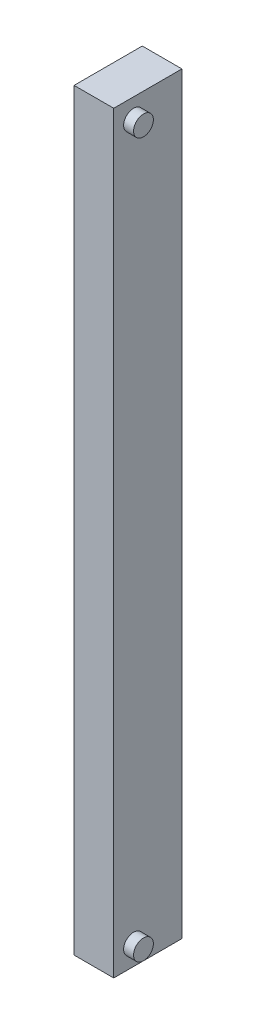
ISO-10303-21;
HEADER;
FILE_DESCRIPTION(('STEP AP214'),'2;1');
FILE_NAME('part.step','',(''),(''),'','','');
FILE_SCHEMA(('AUTOMOTIVE_DESIGN { 1 0 10303 214 1 1 1 1 }'));
ENDSEC;
DATA;
#1=APPLICATION_CONTEXT('core data for automotive mechanical design processes');
#2=APPLICATION_PROTOCOL_DEFINITION('international standard','automotive_design',2000,#1);
#3=PRODUCT_CONTEXT('',#1,'mechanical');
#4=PRODUCT('Part','Part','',(#3));
#5=PRODUCT_RELATED_PRODUCT_CATEGORY('part','',(#4));
#6=PRODUCT_DEFINITION_FORMATION('','',#4);
#7=PRODUCT_DEFINITION_CONTEXT('part definition',#1,'design');
#8=PRODUCT_DEFINITION('design','',#6,#7);
#9=PRODUCT_DEFINITION_SHAPE('','',#8);
#10=(LENGTH_UNIT() NAMED_UNIT(*) SI_UNIT(.MILLI.,.METRE.));
#11=(NAMED_UNIT(*) PLANE_ANGLE_UNIT() SI_UNIT($,.RADIAN.));
#12=(NAMED_UNIT(*) SI_UNIT($,.STERADIAN.) SOLID_ANGLE_UNIT());
#13=UNCERTAINTY_MEASURE_WITH_UNIT(LENGTH_MEASURE(1.E-05),#10,'distance_accuracy_value','');
#14=(GEOMETRIC_REPRESENTATION_CONTEXT(3) GLOBAL_UNCERTAINTY_ASSIGNED_CONTEXT((#13)) GLOBAL_UNIT_ASSIGNED_CONTEXT((#10,
#11,#12)) REPRESENTATION_CONTEXT('',''));
#15=CARTESIAN_POINT('',(0.,0.,0.));
#16=DIRECTION('',(0.,0.,1.));
#17=DIRECTION('',(1.,0.,0.));
#18=AXIS2_PLACEMENT_3D('',#15,#16,#17);
#19=CARTESIAN_POINT('',(0.,482.6,0.));
#20=DIRECTION('',(1.,0.,0.));
#21=DIRECTION('',(0.,0.,-1.));
#22=AXIS2_PLACEMENT_3D('',#19,#20,#21);
#23=PLANE('',#22);
#24=DIRECTION('',(0.,0.,1.));
#25=VECTOR('',#24,1.);
#26=CARTESIAN_POINT('',(0.,0.,0.));
#27=LINE('',#26,#25);
#28=CARTESIAN_POINT('',(0.,0.,-43.688));
#29=VERTEX_POINT('',#28);
#30=CARTESIAN_POINT('',(0.,0.,0.));
#31=VERTEX_POINT('',#30);
#32=EDGE_CURVE('E72',#29,#31,#27,.T.);
#33=ORIENTED_EDGE('',*,*,#32,.T.);
#34=DIRECTION('',(0.,-1.,0.));
#35=VECTOR('',#34,1.);
#36=CARTESIAN_POINT('',(0.,482.6,0.));
#37=LINE('',#36,#35);
#38=CARTESIAN_POINT('',(0.,482.6,0.));
#39=VERTEX_POINT('',#38);
#40=EDGE_CURVE('E88',#39,#31,#37,.T.);
#41=ORIENTED_EDGE('',*,*,#40,.F.);
#42=DIRECTION('',(0.,0.,1.));
#43=VECTOR('',#42,1.);
#44=CARTESIAN_POINT('',(0.,482.6,0.));
#45=LINE('',#44,#43);
#46=CARTESIAN_POINT('',(0.,482.6,-43.688));
#47=VERTEX_POINT('',#46);
#48=EDGE_CURVE('E84',#47,#39,#45,.T.);
#49=ORIENTED_EDGE('',*,*,#48,.F.);
#50=DIRECTION('',(0.,1.,0.));
#51=VECTOR('',#50,1.);
#52=CARTESIAN_POINT('',(0.,0.,-43.688));
#53=LINE('',#52,#51);
#54=EDGE_CURVE('E87',#29,#47,#53,.T.);
#55=ORIENTED_EDGE('',*,*,#54,.F.);
#56=EDGE_LOOP('',(#33,#41,#49,#55));
#57=FACE_BOUND('',#56,.T.);
#58=ADVANCED_FACE('F39',(#57),#23,.F.);
#59=CARTESIAN_POINT('',(0.,482.6,0.));
#60=DIRECTION('',(0.,0.,-1.));
#61=DIRECTION('',(-1.,0.,0.));
#62=AXIS2_PLACEMENT_3D('',#59,#60,#61);
#63=PLANE('',#62);
#64=DIRECTION('',(1.,0.,0.));
#65=VECTOR('',#64,1.);
#66=CARTESIAN_POINT('',(0.,0.,0.));
#67=LINE('',#66,#65);
#68=CARTESIAN_POINT('',(25.4,0.,0.));
#69=VERTEX_POINT('',#68);
#70=EDGE_CURVE('E67',#31,#69,#67,.T.);
#71=ORIENTED_EDGE('',*,*,#70,.T.);
#72=DIRECTION('',(0.,-1.,0.));
#73=VECTOR('',#72,1.);
#74=CARTESIAN_POINT('',(25.4,482.6,0.));
#75=LINE('',#74,#73);
#76=CARTESIAN_POINT('',(25.4,482.6,0.));
#77=VERTEX_POINT('',#76);
#78=EDGE_CURVE('E124',#77,#69,#75,.T.);
#79=ORIENTED_EDGE('',*,*,#78,.F.);
#80=DIRECTION('',(1.,0.,0.));
#81=VECTOR('',#80,1.);
#82=CARTESIAN_POINT('',(0.,482.6,0.));
#83=LINE('',#82,#81);
#84=EDGE_CURVE('E56',#39,#77,#83,.T.);
#85=ORIENTED_EDGE('',*,*,#84,.F.);
#86=ORIENTED_EDGE('',*,*,#40,.T.);
#87=EDGE_LOOP('',(#71,#79,#85,#86));
#88=FACE_BOUND('',#87,.T.);
#89=ADVANCED_FACE('F144',(#88),#63,.F.);
#90=CARTESIAN_POINT('',(25.4,482.6,0.));
#91=DIRECTION('',(-1.,0.,0.));
#92=DIRECTION('',(0.,0.,1.));
#93=AXIS2_PLACEMENT_3D('',#90,#91,#92);
#94=PLANE('',#93);
#95=CARTESIAN_POINT('',(25.4,12.7,-12.7));
#96=DIRECTION('',(-1.,0.,0.));
#97=DIRECTION('',(0.,0.,1.));
#98=AXIS2_PLACEMENT_3D('',#95,#96,#97);
#99=CIRCLE('',#98,6.35);
#100=CARTESIAN_POINT('',(25.4,12.7,-6.34999999999999));
#101=VERTEX_POINT('',#100);
#102=EDGE_CURVE('E11',#101,#101,#99,.F.);
#103=ORIENTED_EDGE('',*,*,#102,.F.);
#104=EDGE_LOOP('',(#103));
#105=FACE_BOUND('',#104,.T.);
#106=CARTESIAN_POINT('',(25.4,469.9,-12.7));
#107=DIRECTION('',(-1.,0.,0.));
#108=DIRECTION('',(0.,0.,1.));
#109=AXIS2_PLACEMENT_3D('',#106,#107,#108);
#110=CIRCLE('',#109,6.35);
#111=CARTESIAN_POINT('',(25.4,469.9,-6.35));
#112=VERTEX_POINT('',#111);
#113=EDGE_CURVE('E48',#112,#112,#110,.F.);
#114=ORIENTED_EDGE('',*,*,#113,.F.);
#115=EDGE_LOOP('',(#114));
#116=FACE_BOUND('',#115,.T.);
#117=DIRECTION('',(0.,0.,-1.));
#118=VECTOR('',#117,1.);
#119=CARTESIAN_POINT('',(25.4,0.,0.));
#120=LINE('',#119,#118);
#121=CARTESIAN_POINT('',(25.4,0.,-43.688));
#122=VERTEX_POINT('',#121);
#123=EDGE_CURVE('E90',#69,#122,#120,.T.);
#124=ORIENTED_EDGE('',*,*,#123,.T.);
#125=DIRECTION('',(0.,-1.,0.));
#126=VECTOR('',#125,1.);
#127=CARTESIAN_POINT('',(25.4,0.,-43.688));
#128=LINE('',#127,#126);
#129=CARTESIAN_POINT('',(25.4,482.6,-43.688));
#130=VERTEX_POINT('',#129);
#131=EDGE_CURVE('E101',#130,#122,#128,.T.);
#132=ORIENTED_EDGE('',*,*,#131,.F.);
#133=DIRECTION('',(0.,0.,-1.));
#134=VECTOR('',#133,1.);
#135=CARTESIAN_POINT('',(25.4,482.6,0.));
#136=LINE('',#135,#134);
#137=EDGE_CURVE('E96',#77,#130,#136,.T.);
#138=ORIENTED_EDGE('',*,*,#137,.F.);
#139=ORIENTED_EDGE('',*,*,#78,.T.);
#140=EDGE_LOOP('',(#124,#132,#138,#139));
#141=FACE_BOUND('',#140,.T.);
#142=ADVANCED_FACE('F141',(#105,#116,#141),#94,.F.);
#143=CARTESIAN_POINT('',(0.,482.6,0.));
#144=DIRECTION('',(0.,-1.,0.));
#145=DIRECTION('',(0.,0.,-1.));
#146=AXIS2_PLACEMENT_3D('',#143,#144,#145);
#147=PLANE('',#146);
#148=ORIENTED_EDGE('',*,*,#48,.T.);
#149=ORIENTED_EDGE('',*,*,#84,.T.);
#150=ORIENTED_EDGE('',*,*,#137,.T.);
#151=DIRECTION('',(1.,0.,0.));
#152=VECTOR('',#151,1.);
#153=CARTESIAN_POINT('',(0.,482.6,-43.688));
#154=LINE('',#153,#152);
#155=EDGE_CURVE('E93',#47,#130,#154,.T.);
#156=ORIENTED_EDGE('',*,*,#155,.F.);
#157=EDGE_LOOP('',(#148,#149,#150,#156));
#158=FACE_BOUND('',#157,.T.);
#159=ADVANCED_FACE('F94',(#158),#147,.F.);
#160=CARTESIAN_POINT('',(0.,0.,0.));
#161=DIRECTION('',(0.,-1.,0.));
#162=DIRECTION('',(0.,0.,-1.));
#163=AXIS2_PLACEMENT_3D('',#160,#161,#162);
#164=PLANE('',#163);
#165=ORIENTED_EDGE('',*,*,#32,.F.);
#166=DIRECTION('',(-1.,0.,0.));
#167=VECTOR('',#166,1.);
#168=CARTESIAN_POINT('',(0.,0.,-43.688));
#169=LINE('',#168,#167);
#170=EDGE_CURVE('E104',#122,#29,#169,.T.);
#171=ORIENTED_EDGE('',*,*,#170,.F.);
#172=ORIENTED_EDGE('',*,*,#123,.F.);
#173=ORIENTED_EDGE('',*,*,#70,.F.);
#174=EDGE_LOOP('',(#165,#171,#172,#173));
#175=FACE_BOUND('',#174,.T.);
#176=ADVANCED_FACE('F147',(#175),#164,.T.);
#177=CARTESIAN_POINT('',(31.75,469.9,-12.7));
#178=DIRECTION('',(-1.,0.,0.));
#179=DIRECTION('',(0.,0.,1.));
#180=AXIS2_PLACEMENT_3D('',#177,#178,#179);
#181=CYLINDRICAL_SURFACE('',#180,6.35);
#182=CARTESIAN_POINT('',(31.75,469.9,-12.7));
#183=DIRECTION('',(1.,0.,0.));
#184=DIRECTION('',(0.,0.,-1.));
#185=AXIS2_PLACEMENT_3D('',#182,#183,#184);
#186=CIRCLE('',#185,6.35);
#187=CARTESIAN_POINT('',(31.75,469.9,-19.05));
#188=VERTEX_POINT('',#187);
#189=EDGE_CURVE('E116',#188,#188,#186,.T.);
#190=ORIENTED_EDGE('',*,*,#189,.F.);
#191=EDGE_LOOP('',(#190));
#192=FACE_BOUND('',#191,.T.);
#193=ORIENTED_EDGE('',*,*,#113,.T.);
#194=EDGE_LOOP('',(#193));
#195=FACE_BOUND('',#194,.T.);
#196=ADVANCED_FACE('F139',(#192,#195),#181,.T.);
#197=CARTESIAN_POINT('',(31.75,469.9,-12.7));
#198=DIRECTION('',(1.,0.,0.));
#199=DIRECTION('',(0.,0.,-1.));
#200=AXIS2_PLACEMENT_3D('',#197,#198,#199);
#201=PLANE('',#200);
#202=ORIENTED_EDGE('',*,*,#189,.T.);
#203=EDGE_LOOP('',(#202));
#204=FACE_BOUND('',#203,.T.);
#205=ADVANCED_FACE('F154',(#204),#201,.T.);
#206=CARTESIAN_POINT('',(31.75,12.7,-12.7));
#207=DIRECTION('',(-1.,0.,0.));
#208=DIRECTION('',(0.,0.,1.));
#209=AXIS2_PLACEMENT_3D('',#206,#207,#208);
#210=CYLINDRICAL_SURFACE('',#209,6.35);
#211=CARTESIAN_POINT('',(31.75,12.7,-12.7));
#212=DIRECTION('',(1.,0.,0.));
#213=DIRECTION('',(0.,0.,-1.));
#214=AXIS2_PLACEMENT_3D('',#211,#212,#213);
#215=CIRCLE('',#214,6.35);
#216=CARTESIAN_POINT('',(31.75,12.7,-19.05));
#217=VERTEX_POINT('',#216);
#218=EDGE_CURVE('E112',#217,#217,#215,.T.);
#219=ORIENTED_EDGE('',*,*,#218,.F.);
#220=EDGE_LOOP('',(#219));
#221=FACE_BOUND('',#220,.T.);
#222=ORIENTED_EDGE('',*,*,#102,.T.);
#223=EDGE_LOOP('',(#222));
#224=FACE_BOUND('',#223,.T.);
#225=ADVANCED_FACE('F197',(#221,#224),#210,.T.);
#226=CARTESIAN_POINT('',(31.75,12.7,-12.7));
#227=DIRECTION('',(1.,0.,0.));
#228=DIRECTION('',(0.,0.,-1.));
#229=AXIS2_PLACEMENT_3D('',#226,#227,#228);
#230=PLANE('',#229);
#231=ORIENTED_EDGE('',*,*,#218,.T.);
#232=EDGE_LOOP('',(#231));
#233=FACE_BOUND('',#232,.T.);
#234=ADVANCED_FACE('F188',(#233),#230,.T.);
#235=CARTESIAN_POINT('',(0.,0.,-43.688));
#236=DIRECTION('',(0.,0.,-1.));
#237=DIRECTION('',(-1.,0.,0.));
#238=AXIS2_PLACEMENT_3D('',#235,#236,#237);
#239=PLANE('',#238);
#240=ORIENTED_EDGE('',*,*,#54,.T.);
#241=ORIENTED_EDGE('',*,*,#155,.T.);
#242=ORIENTED_EDGE('',*,*,#131,.T.);
#243=ORIENTED_EDGE('',*,*,#170,.T.);
#244=EDGE_LOOP('',(#240,#241,#242,#243));
#245=FACE_BOUND('',#244,.T.);
#246=ADVANCED_FACE('F103',(#245),#239,.T.);
#247=CLOSED_SHELL('',(#58,#89,#142,#159,#176,#196,#205,#225,#234,#246));
#248=MANIFOLD_SOLID_BREP('B2',#247);
#249=ADVANCED_BREP_SHAPE_REPRESENTATION('',(#18,#248),#14);
#250=SHAPE_DEFINITION_REPRESENTATION(#9,#249);
ENDSEC;
END-ISO-10303-21;
